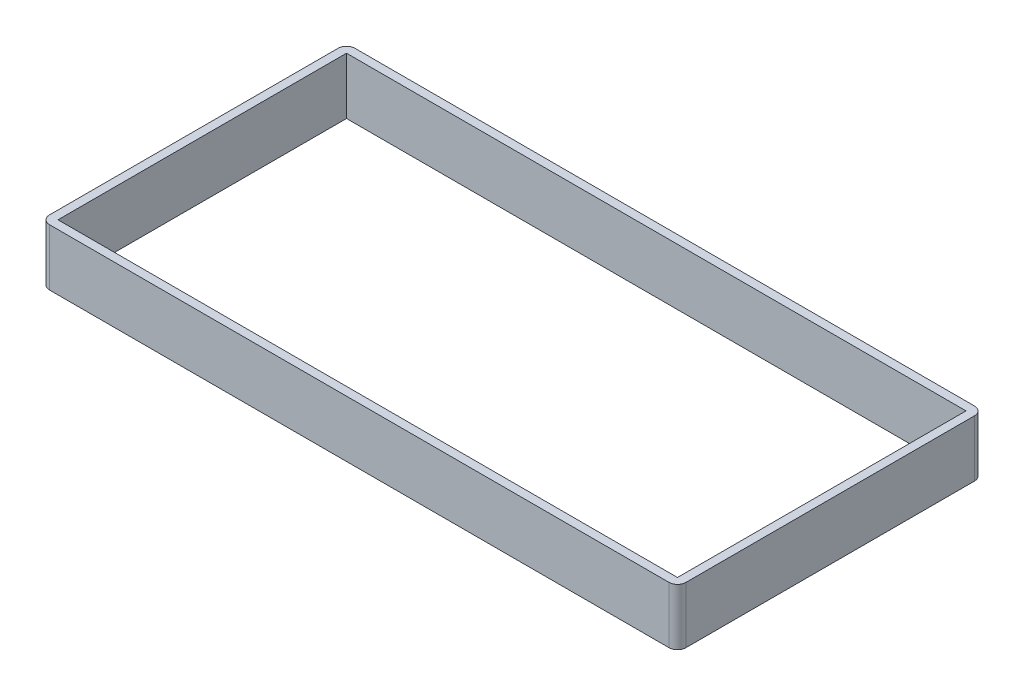
ISO-10303-21;
HEADER;
FILE_DESCRIPTION(('STEP AP214'),'2;1');
FILE_NAME('part.step','',(''),(''),'','','');
FILE_SCHEMA(('AUTOMOTIVE_DESIGN { 1 0 10303 214 1 1 1 1 }'));
ENDSEC;
DATA;
#1=APPLICATION_CONTEXT('core data for automotive mechanical design processes');
#2=APPLICATION_PROTOCOL_DEFINITION('international standard','automotive_design',2000,#1);
#3=PRODUCT_CONTEXT('',#1,'mechanical');
#4=PRODUCT('Part','Part','',(#3));
#5=PRODUCT_RELATED_PRODUCT_CATEGORY('part','',(#4));
#6=PRODUCT_DEFINITION_FORMATION('','',#4);
#7=PRODUCT_DEFINITION_CONTEXT('part definition',#1,'design');
#8=PRODUCT_DEFINITION('design','',#6,#7);
#9=PRODUCT_DEFINITION_SHAPE('','',#8);
#10=(LENGTH_UNIT() NAMED_UNIT(*) SI_UNIT(.MILLI.,.METRE.));
#11=(NAMED_UNIT(*) PLANE_ANGLE_UNIT() SI_UNIT($,.RADIAN.));
#12=(NAMED_UNIT(*) SI_UNIT($,.STERADIAN.) SOLID_ANGLE_UNIT());
#13=UNCERTAINTY_MEASURE_WITH_UNIT(LENGTH_MEASURE(1.E-05),#10,'distance_accuracy_value','');
#14=(GEOMETRIC_REPRESENTATION_CONTEXT(3) GLOBAL_UNCERTAINTY_ASSIGNED_CONTEXT((#13)) GLOBAL_UNIT_ASSIGNED_CONTEXT((#10,
#11,#12)) REPRESENTATION_CONTEXT('',''));
#15=CARTESIAN_POINT('',(0.,0.,0.));
#16=DIRECTION('',(0.,0.,1.));
#17=DIRECTION('',(1.,0.,0.));
#18=AXIS2_PLACEMENT_3D('',#15,#16,#17);
#19=CARTESIAN_POINT('',(0.,10.,0.));
#20=DIRECTION('',(0.,1.,0.));
#21=DIRECTION('',(0.,0.,1.));
#22=AXIS2_PLACEMENT_3D('',#19,#20,#21);
#23=PLANE('',#22);
#24=DIRECTION('',(-1.,0.,0.));
#25=VECTOR('',#24,1.);
#26=CARTESIAN_POINT('',(-109.5,10.,-54.));
#27=LINE('',#26,#25);
#28=CARTESIAN_POINT('',(109.5,10.,-54.));
#29=VERTEX_POINT('',#28);
#30=CARTESIAN_POINT('',(-109.5,10.,-54.));
#31=VERTEX_POINT('',#30);
#32=EDGE_CURVE('E200',#29,#31,#27,.T.);
#33=ORIENTED_EDGE('',*,*,#32,.T.);
#34=CARTESIAN_POINT('',(-109.5,10.,-51.));
#35=DIRECTION('',(0.,1.,0.));
#36=DIRECTION('',(0.,0.,1.));
#37=AXIS2_PLACEMENT_3D('',#34,#35,#36);
#38=CIRCLE('',#37,3.);
#39=CARTESIAN_POINT('',(-112.5,10.,-51.));
#40=VERTEX_POINT('',#39);
#41=EDGE_CURVE('E235',#31,#40,#38,.T.);
#42=ORIENTED_EDGE('',*,*,#41,.T.);
#43=DIRECTION('',(0.,0.,1.));
#44=VECTOR('',#43,1.);
#45=CARTESIAN_POINT('',(-112.5,10.,-51.));
#46=LINE('',#45,#44);
#47=CARTESIAN_POINT('',(-112.5,10.,51.));
#48=VERTEX_POINT('',#47);
#49=EDGE_CURVE('E192',#40,#48,#46,.T.);
#50=ORIENTED_EDGE('',*,*,#49,.T.);
#51=CARTESIAN_POINT('',(-109.5,10.,51.));
#52=DIRECTION('',(0.,1.,0.));
#53=DIRECTION('',(0.,0.,1.));
#54=AXIS2_PLACEMENT_3D('',#51,#52,#53);
#55=CIRCLE('',#54,3.);
#56=CARTESIAN_POINT('',(-109.5,10.,54.));
#57=VERTEX_POINT('',#56);
#58=EDGE_CURVE('E233',#48,#57,#55,.T.);
#59=ORIENTED_EDGE('',*,*,#58,.T.);
#60=DIRECTION('',(1.,0.,0.));
#61=VECTOR('',#60,1.);
#62=CARTESIAN_POINT('',(-109.5,10.,54.));
#63=LINE('',#62,#61);
#64=CARTESIAN_POINT('',(109.5,10.,54.));
#65=VERTEX_POINT('',#64);
#66=EDGE_CURVE('E195',#57,#65,#63,.T.);
#67=ORIENTED_EDGE('',*,*,#66,.T.);
#68=CARTESIAN_POINT('',(109.5,10.,51.));
#69=DIRECTION('',(0.,1.,0.));
#70=DIRECTION('',(0.,0.,1.));
#71=AXIS2_PLACEMENT_3D('',#68,#69,#70);
#72=CIRCLE('',#71,3.);
#73=CARTESIAN_POINT('',(112.5,10.,51.));
#74=VERTEX_POINT('',#73);
#75=EDGE_CURVE('E81',#65,#74,#72,.T.);
#76=ORIENTED_EDGE('',*,*,#75,.T.);
#77=DIRECTION('',(0.,0.,-1.));
#78=VECTOR('',#77,1.);
#79=CARTESIAN_POINT('',(112.5,10.,-51.));
#80=LINE('',#79,#78);
#81=CARTESIAN_POINT('',(112.5,10.,-51.));
#82=VERTEX_POINT('',#81);
#83=EDGE_CURVE('E198',#74,#82,#80,.T.);
#84=ORIENTED_EDGE('',*,*,#83,.T.);
#85=CARTESIAN_POINT('',(109.5,10.,-51.));
#86=DIRECTION('',(0.,1.,0.));
#87=DIRECTION('',(0.,0.,1.));
#88=AXIS2_PLACEMENT_3D('',#85,#86,#87);
#89=CIRCLE('',#88,3.);
#90=EDGE_CURVE('E231',#82,#29,#89,.T.);
#91=ORIENTED_EDGE('',*,*,#90,.T.);
#92=EDGE_LOOP('',(#33,#42,#50,#59,#67,#76,#84,#91));
#93=FACE_BOUND('',#92,.T.);
#94=DIRECTION('',(1.,0.,0.));
#95=VECTOR('',#94,1.);
#96=CARTESIAN_POINT('',(-109.5,10.,51.));
#97=LINE('',#96,#95);
#98=CARTESIAN_POINT('',(-109.5,10.,51.));
#99=VERTEX_POINT('',#98);
#100=CARTESIAN_POINT('',(109.5,10.,51.));
#101=VERTEX_POINT('',#100);
#102=EDGE_CURVE('E161',#99,#101,#97,.T.);
#103=ORIENTED_EDGE('',*,*,#102,.F.);
#104=DIRECTION('',(0.,0.,1.));
#105=VECTOR('',#104,1.);
#106=CARTESIAN_POINT('',(-109.5,10.,-51.));
#107=LINE('',#106,#105);
#108=CARTESIAN_POINT('',(-109.5,10.,-51.));
#109=VERTEX_POINT('',#108);
#110=EDGE_CURVE('E151',#109,#99,#107,.T.);
#111=ORIENTED_EDGE('',*,*,#110,.F.);
#112=DIRECTION('',(-1.,0.,0.));
#113=VECTOR('',#112,1.);
#114=CARTESIAN_POINT('',(-109.5,10.,-51.));
#115=LINE('',#114,#113);
#116=CARTESIAN_POINT('',(109.5,10.,-51.));
#117=VERTEX_POINT('',#116);
#118=EDGE_CURVE('E176',#117,#109,#115,.T.);
#119=ORIENTED_EDGE('',*,*,#118,.F.);
#120=DIRECTION('',(0.,0.,-1.));
#121=VECTOR('',#120,1.);
#122=CARTESIAN_POINT('',(109.5,10.,-51.));
#123=LINE('',#122,#121);
#124=EDGE_CURVE('E174',#101,#117,#123,.T.);
#125=ORIENTED_EDGE('',*,*,#124,.F.);
#126=EDGE_LOOP('',(#103,#111,#119,#125));
#127=FACE_BOUND('',#126,.T.);
#128=ADVANCED_FACE('F61',(#93,#127),#23,.T.);
#129=CARTESIAN_POINT('',(0.,-10.,0.));
#130=DIRECTION('',(0.,1.,0.));
#131=DIRECTION('',(0.,0.,1.));
#132=AXIS2_PLACEMENT_3D('',#129,#130,#131);
#133=PLANE('',#132);
#134=DIRECTION('',(0.,0.,1.));
#135=VECTOR('',#134,1.);
#136=CARTESIAN_POINT('',(-112.5,-10.,-51.));
#137=LINE('',#136,#135);
#138=CARTESIAN_POINT('',(-112.5,-10.,-51.));
#139=VERTEX_POINT('',#138);
#140=CARTESIAN_POINT('',(-112.5,-10.,51.));
#141=VERTEX_POINT('',#140);
#142=EDGE_CURVE('E169',#139,#141,#137,.T.);
#143=ORIENTED_EDGE('',*,*,#142,.F.);
#144=CARTESIAN_POINT('',(-109.5,-10.,-51.));
#145=DIRECTION('',(0.,1.,0.));
#146=DIRECTION('',(0.,0.,1.));
#147=AXIS2_PLACEMENT_3D('',#144,#145,#146);
#148=CIRCLE('',#147,3.);
#149=CARTESIAN_POINT('',(-109.5,-10.,-54.));
#150=VERTEX_POINT('',#149);
#151=EDGE_CURVE('E223',#139,#150,#148,.F.);
#152=ORIENTED_EDGE('',*,*,#151,.T.);
#153=DIRECTION('',(-1.,0.,0.));
#154=VECTOR('',#153,1.);
#155=CARTESIAN_POINT('',(-109.5,-10.,-54.));
#156=LINE('',#155,#154);
#157=CARTESIAN_POINT('',(109.5,-10.,-54.));
#158=VERTEX_POINT('',#157);
#159=EDGE_CURVE('E196',#158,#150,#156,.T.);
#160=ORIENTED_EDGE('',*,*,#159,.F.);
#161=CARTESIAN_POINT('',(109.5,-10.,-51.));
#162=DIRECTION('',(0.,1.,0.));
#163=DIRECTION('',(0.,0.,1.));
#164=AXIS2_PLACEMENT_3D('',#161,#162,#163);
#165=CIRCLE('',#164,3.);
#166=CARTESIAN_POINT('',(112.5,-10.,-51.));
#167=VERTEX_POINT('',#166);
#168=EDGE_CURVE('E219',#158,#167,#165,.F.);
#169=ORIENTED_EDGE('',*,*,#168,.T.);
#170=DIRECTION('',(0.,0.,-1.));
#171=VECTOR('',#170,1.);
#172=CARTESIAN_POINT('',(112.5,-10.,-51.));
#173=LINE('',#172,#171);
#174=CARTESIAN_POINT('',(112.5,-10.,51.));
#175=VERTEX_POINT('',#174);
#176=EDGE_CURVE('E209',#175,#167,#173,.T.);
#177=ORIENTED_EDGE('',*,*,#176,.F.);
#178=CARTESIAN_POINT('',(109.5,-10.,51.));
#179=DIRECTION('',(0.,1.,0.));
#180=DIRECTION('',(0.,0.,1.));
#181=AXIS2_PLACEMENT_3D('',#178,#179,#180);
#182=CIRCLE('',#181,3.);
#183=CARTESIAN_POINT('',(109.5,-10.,54.));
#184=VERTEX_POINT('',#183);
#185=EDGE_CURVE('E217',#175,#184,#182,.F.);
#186=ORIENTED_EDGE('',*,*,#185,.T.);
#187=DIRECTION('',(1.,0.,0.));
#188=VECTOR('',#187,1.);
#189=CARTESIAN_POINT('',(-109.5,-10.,54.));
#190=LINE('',#189,#188);
#191=CARTESIAN_POINT('',(-109.5,-10.,54.));
#192=VERTEX_POINT('',#191);
#193=EDGE_CURVE('E206',#192,#184,#190,.T.);
#194=ORIENTED_EDGE('',*,*,#193,.F.);
#195=CARTESIAN_POINT('',(-109.5,-10.,51.));
#196=DIRECTION('',(0.,1.,0.));
#197=DIRECTION('',(0.,0.,1.));
#198=AXIS2_PLACEMENT_3D('',#195,#196,#197);
#199=CIRCLE('',#198,3.);
#200=EDGE_CURVE('E221',#192,#141,#199,.F.);
#201=ORIENTED_EDGE('',*,*,#200,.T.);
#202=EDGE_LOOP('',(#143,#152,#160,#169,#177,#186,#194,#201));
#203=FACE_BOUND('',#202,.T.);
#204=DIRECTION('',(0.,0.,1.));
#205=VECTOR('',#204,1.);
#206=CARTESIAN_POINT('',(-109.5,-10.,-51.));
#207=LINE('',#206,#205);
#208=CARTESIAN_POINT('',(-109.5,-10.,-51.));
#209=VERTEX_POINT('',#208);
#210=CARTESIAN_POINT('',(-109.5,-10.,51.));
#211=VERTEX_POINT('',#210);
#212=EDGE_CURVE('E180',#209,#211,#207,.T.);
#213=ORIENTED_EDGE('',*,*,#212,.T.);
#214=DIRECTION('',(1.,0.,0.));
#215=VECTOR('',#214,1.);
#216=CARTESIAN_POINT('',(-109.5,-10.,51.));
#217=LINE('',#216,#215);
#218=CARTESIAN_POINT('',(109.5,-10.,51.));
#219=VERTEX_POINT('',#218);
#220=EDGE_CURVE('E168',#211,#219,#217,.T.);
#221=ORIENTED_EDGE('',*,*,#220,.T.);
#222=DIRECTION('',(0.,0.,-1.));
#223=VECTOR('',#222,1.);
#224=CARTESIAN_POINT('',(109.5,-10.,-51.));
#225=LINE('',#224,#223);
#226=CARTESIAN_POINT('',(109.5,-10.,-51.));
#227=VERTEX_POINT('',#226);
#228=EDGE_CURVE('E183',#219,#227,#225,.T.);
#229=ORIENTED_EDGE('',*,*,#228,.T.);
#230=DIRECTION('',(-1.,0.,0.));
#231=VECTOR('',#230,1.);
#232=CARTESIAN_POINT('',(-109.5,-10.,-51.));
#233=LINE('',#232,#231);
#234=EDGE_CURVE('E162',#227,#209,#233,.T.);
#235=ORIENTED_EDGE('',*,*,#234,.T.);
#236=EDGE_LOOP('',(#213,#221,#229,#235));
#237=FACE_BOUND('',#236,.T.);
#238=ADVANCED_FACE('F248',(#203,#237),#133,.F.);
#239=CARTESIAN_POINT('',(-112.5,10.,-51.));
#240=DIRECTION('',(1.,0.,0.));
#241=DIRECTION('',(0.,0.,-1.));
#242=AXIS2_PLACEMENT_3D('',#239,#240,#241);
#243=PLANE('',#242);
#244=ORIENTED_EDGE('',*,*,#49,.F.);
#245=DIRECTION('',(0.,-1.,0.));
#246=VECTOR('',#245,1.);
#247=CARTESIAN_POINT('',(-112.5,10.,-51.));
#248=LINE('',#247,#246);
#249=EDGE_CURVE('E214',#40,#139,#248,.T.);
#250=ORIENTED_EDGE('',*,*,#249,.T.);
#251=ORIENTED_EDGE('',*,*,#142,.T.);
#252=DIRECTION('',(0.,-1.,0.));
#253=VECTOR('',#252,1.);
#254=CARTESIAN_POINT('',(-112.5,10.,51.));
#255=LINE('',#254,#253);
#256=EDGE_CURVE('E203',#141,#48,#255,.F.);
#257=ORIENTED_EDGE('',*,*,#256,.T.);
#258=EDGE_LOOP('',(#244,#250,#251,#257));
#259=FACE_BOUND('',#258,.T.);
#260=ADVANCED_FACE('F266',(#259),#243,.F.);
#261=CARTESIAN_POINT('',(-109.5,10.,54.));
#262=DIRECTION('',(0.,0.,-1.));
#263=DIRECTION('',(-1.,0.,0.));
#264=AXIS2_PLACEMENT_3D('',#261,#262,#263);
#265=PLANE('',#264);
#266=ORIENTED_EDGE('',*,*,#66,.F.);
#267=DIRECTION('',(0.,-1.,0.));
#268=VECTOR('',#267,1.);
#269=CARTESIAN_POINT('',(-109.5,10.,54.));
#270=LINE('',#269,#268);
#271=EDGE_CURVE('E239',#57,#192,#270,.T.);
#272=ORIENTED_EDGE('',*,*,#271,.T.);
#273=ORIENTED_EDGE('',*,*,#193,.T.);
#274=DIRECTION('',(0.,-1.,0.));
#275=VECTOR('',#274,1.);
#276=CARTESIAN_POINT('',(109.5,10.,54.));
#277=LINE('',#276,#275);
#278=EDGE_CURVE('E237',#184,#65,#277,.F.);
#279=ORIENTED_EDGE('',*,*,#278,.T.);
#280=EDGE_LOOP('',(#266,#272,#273,#279));
#281=FACE_BOUND('',#280,.T.);
#282=ADVANCED_FACE('F274',(#281),#265,.F.);
#283=CARTESIAN_POINT('',(112.5,10.,-51.));
#284=DIRECTION('',(-1.,0.,0.));
#285=DIRECTION('',(0.,0.,1.));
#286=AXIS2_PLACEMENT_3D('',#283,#284,#285);
#287=PLANE('',#286);
#288=ORIENTED_EDGE('',*,*,#176,.T.);
#289=DIRECTION('',(0.,-1.,0.));
#290=VECTOR('',#289,1.);
#291=CARTESIAN_POINT('',(112.5,10.,-51.));
#292=LINE('',#291,#290);
#293=EDGE_CURVE('E12',#167,#82,#292,.F.);
#294=ORIENTED_EDGE('',*,*,#293,.T.);
#295=ORIENTED_EDGE('',*,*,#83,.F.);
#296=DIRECTION('',(0.,-1.,0.));
#297=VECTOR('',#296,1.);
#298=CARTESIAN_POINT('',(112.5,10.,51.));
#299=LINE('',#298,#297);
#300=EDGE_CURVE('E69',#74,#175,#299,.T.);
#301=ORIENTED_EDGE('',*,*,#300,.T.);
#302=EDGE_LOOP('',(#288,#294,#295,#301));
#303=FACE_BOUND('',#302,.T.);
#304=ADVANCED_FACE('F244',(#303),#287,.F.);
#305=CARTESIAN_POINT('',(-109.5,10.,-54.));
#306=DIRECTION('',(0.,0.,1.));
#307=DIRECTION('',(1.,0.,0.));
#308=AXIS2_PLACEMENT_3D('',#305,#306,#307);
#309=PLANE('',#308);
#310=ORIENTED_EDGE('',*,*,#159,.T.);
#311=DIRECTION('',(0.,-1.,0.));
#312=VECTOR('',#311,1.);
#313=CARTESIAN_POINT('',(-109.5,10.,-54.));
#314=LINE('',#313,#312);
#315=EDGE_CURVE('E228',#150,#31,#314,.F.);
#316=ORIENTED_EDGE('',*,*,#315,.T.);
#317=ORIENTED_EDGE('',*,*,#32,.F.);
#318=DIRECTION('',(0.,-1.,0.));
#319=VECTOR('',#318,1.);
#320=CARTESIAN_POINT('',(109.5,10.,-54.));
#321=LINE('',#320,#319);
#322=EDGE_CURVE('E225',#29,#158,#321,.T.);
#323=ORIENTED_EDGE('',*,*,#322,.T.);
#324=EDGE_LOOP('',(#310,#316,#317,#323));
#325=FACE_BOUND('',#324,.T.);
#326=ADVANCED_FACE('F258',(#325),#309,.F.);
#327=CARTESIAN_POINT('',(-109.5,10.,-51.));
#328=DIRECTION('',(1.,0.,0.));
#329=DIRECTION('',(0.,0.,-1.));
#330=AXIS2_PLACEMENT_3D('',#327,#328,#329);
#331=PLANE('',#330);
#332=ORIENTED_EDGE('',*,*,#212,.F.);
#333=DIRECTION('',(0.,-1.,0.));
#334=VECTOR('',#333,1.);
#335=CARTESIAN_POINT('',(-109.5,10.,-51.));
#336=LINE('',#335,#334);
#337=EDGE_CURVE('E157',#109,#209,#336,.T.);
#338=ORIENTED_EDGE('',*,*,#337,.F.);
#339=ORIENTED_EDGE('',*,*,#110,.T.);
#340=DIRECTION('',(0.,-1.,0.));
#341=VECTOR('',#340,1.);
#342=CARTESIAN_POINT('',(-109.5,10.,51.));
#343=LINE('',#342,#341);
#344=EDGE_CURVE('E154',#99,#211,#343,.T.);
#345=ORIENTED_EDGE('',*,*,#344,.T.);
#346=EDGE_LOOP('',(#332,#338,#339,#345));
#347=FACE_BOUND('',#346,.T.);
#348=ADVANCED_FACE('F153',(#347),#331,.T.);
#349=CARTESIAN_POINT('',(-109.5,10.,51.));
#350=DIRECTION('',(0.,0.,-1.));
#351=DIRECTION('',(-1.,0.,0.));
#352=AXIS2_PLACEMENT_3D('',#349,#350,#351);
#353=PLANE('',#352);
#354=ORIENTED_EDGE('',*,*,#220,.F.);
#355=ORIENTED_EDGE('',*,*,#344,.F.);
#356=ORIENTED_EDGE('',*,*,#102,.T.);
#357=DIRECTION('',(0.,-1.,0.));
#358=VECTOR('',#357,1.);
#359=CARTESIAN_POINT('',(109.5,10.,51.));
#360=LINE('',#359,#358);
#361=EDGE_CURVE('E170',#101,#219,#360,.T.);
#362=ORIENTED_EDGE('',*,*,#361,.T.);
#363=EDGE_LOOP('',(#354,#355,#356,#362));
#364=FACE_BOUND('',#363,.T.);
#365=ADVANCED_FACE('F165',(#364),#353,.T.);
#366=CARTESIAN_POINT('',(109.5,10.,-51.));
#367=DIRECTION('',(-1.,0.,0.));
#368=DIRECTION('',(0.,0.,1.));
#369=AXIS2_PLACEMENT_3D('',#366,#367,#368);
#370=PLANE('',#369);
#371=ORIENTED_EDGE('',*,*,#228,.F.);
#372=ORIENTED_EDGE('',*,*,#361,.F.);
#373=ORIENTED_EDGE('',*,*,#124,.T.);
#374=DIRECTION('',(0.,-1.,0.));
#375=VECTOR('',#374,1.);
#376=CARTESIAN_POINT('',(109.5,10.,-51.));
#377=LINE('',#376,#375);
#378=EDGE_CURVE('E189',#117,#227,#377,.T.);
#379=ORIENTED_EDGE('',*,*,#378,.T.);
#380=EDGE_LOOP('',(#371,#372,#373,#379));
#381=FACE_BOUND('',#380,.T.);
#382=ADVANCED_FACE('F330',(#381),#370,.T.);
#383=CARTESIAN_POINT('',(-109.5,10.,-51.));
#384=DIRECTION('',(0.,0.,1.));
#385=DIRECTION('',(1.,0.,0.));
#386=AXIS2_PLACEMENT_3D('',#383,#384,#385);
#387=PLANE('',#386);
#388=ORIENTED_EDGE('',*,*,#234,.F.);
#389=ORIENTED_EDGE('',*,*,#378,.F.);
#390=ORIENTED_EDGE('',*,*,#118,.T.);
#391=ORIENTED_EDGE('',*,*,#337,.T.);
#392=EDGE_LOOP('',(#388,#389,#390,#391));
#393=FACE_BOUND('',#392,.T.);
#394=ADVANCED_FACE('F299',(#393),#387,.T.);
#395=CARTESIAN_POINT('',(-109.5,10.,-51.));
#396=DIRECTION('',(0.,-1.,0.));
#397=DIRECTION('',(0.,0.,-1.));
#398=AXIS2_PLACEMENT_3D('',#395,#396,#397);
#399=CYLINDRICAL_SURFACE('',#398,3.);
#400=ORIENTED_EDGE('',*,*,#41,.F.);
#401=ORIENTED_EDGE('',*,*,#315,.F.);
#402=ORIENTED_EDGE('',*,*,#151,.F.);
#403=ORIENTED_EDGE('',*,*,#249,.F.);
#404=EDGE_LOOP('',(#400,#401,#402,#403));
#405=FACE_BOUND('',#404,.T.);
#406=ADVANCED_FACE('F264',(#405),#399,.T.);
#407=CARTESIAN_POINT('',(-109.5,10.,51.));
#408=DIRECTION('',(0.,-1.,0.));
#409=DIRECTION('',(0.,0.,-1.));
#410=AXIS2_PLACEMENT_3D('',#407,#408,#409);
#411=CYLINDRICAL_SURFACE('',#410,3.);
#412=ORIENTED_EDGE('',*,*,#58,.F.);
#413=ORIENTED_EDGE('',*,*,#256,.F.);
#414=ORIENTED_EDGE('',*,*,#200,.F.);
#415=ORIENTED_EDGE('',*,*,#271,.F.);
#416=EDGE_LOOP('',(#412,#413,#414,#415));
#417=FACE_BOUND('',#416,.T.);
#418=ADVANCED_FACE('F271',(#417),#411,.T.);
#419=CARTESIAN_POINT('',(109.5,10.,-51.));
#420=DIRECTION('',(0.,-1.,0.));
#421=DIRECTION('',(0.,0.,-1.));
#422=AXIS2_PLACEMENT_3D('',#419,#420,#421);
#423=CYLINDRICAL_SURFACE('',#422,3.);
#424=ORIENTED_EDGE('',*,*,#90,.F.);
#425=ORIENTED_EDGE('',*,*,#293,.F.);
#426=ORIENTED_EDGE('',*,*,#168,.F.);
#427=ORIENTED_EDGE('',*,*,#322,.F.);
#428=EDGE_LOOP('',(#424,#425,#426,#427));
#429=FACE_BOUND('',#428,.T.);
#430=ADVANCED_FACE('F255',(#429),#423,.T.);
#431=CARTESIAN_POINT('',(109.5,10.,51.));
#432=DIRECTION('',(0.,-1.,0.));
#433=DIRECTION('',(0.,0.,-1.));
#434=AXIS2_PLACEMENT_3D('',#431,#432,#433);
#435=CYLINDRICAL_SURFACE('',#434,3.);
#436=ORIENTED_EDGE('',*,*,#75,.F.);
#437=ORIENTED_EDGE('',*,*,#278,.F.);
#438=ORIENTED_EDGE('',*,*,#185,.F.);
#439=ORIENTED_EDGE('',*,*,#300,.F.);
#440=EDGE_LOOP('',(#436,#437,#438,#439));
#441=FACE_BOUND('',#440,.T.);
#442=ADVANCED_FACE('F63',(#441),#435,.T.);
#443=CLOSED_SHELL('',(#128,#238,#260,#282,#304,#326,#348,#365,#382,#394,#406,#418,#430,#442));
#444=MANIFOLD_SOLID_BREP('B2',#443);
#445=ADVANCED_BREP_SHAPE_REPRESENTATION('',(#18,#444),#14);
#446=SHAPE_DEFINITION_REPRESENTATION(#9,#445);
ENDSEC;
END-ISO-10303-21;
